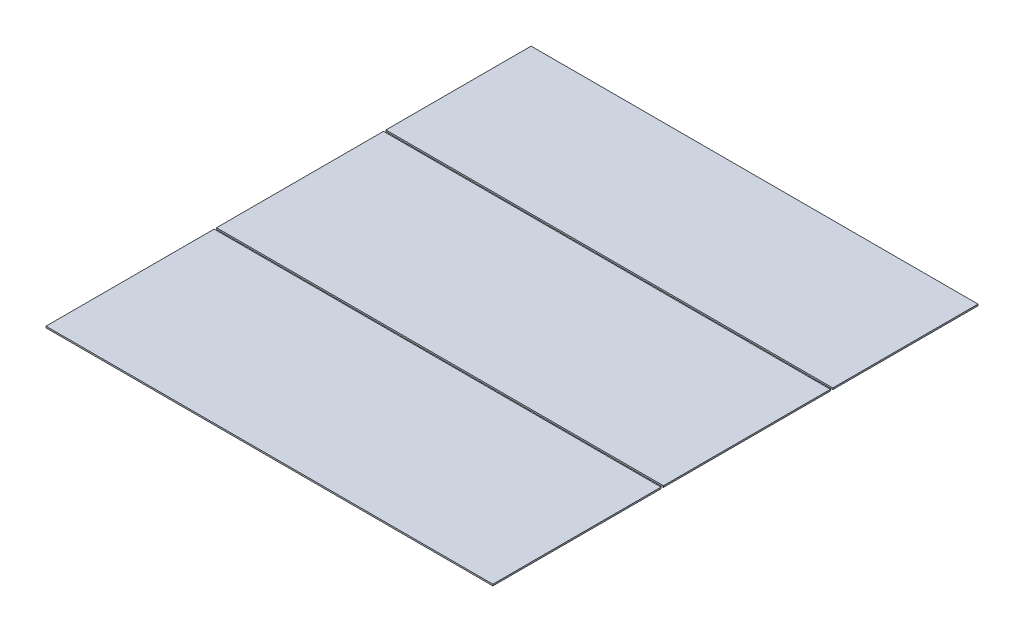
ISO-10303-21;
HEADER;
FILE_DESCRIPTION(('STEP AP214'),'2;1');
FILE_NAME('part.step','',(''),(''),'','','');
FILE_SCHEMA(('AUTOMOTIVE_DESIGN { 1 0 10303 214 1 1 1 1 }'));
ENDSEC;
DATA;
#1=APPLICATION_CONTEXT('core data for automotive mechanical design processes');
#2=APPLICATION_PROTOCOL_DEFINITION('international standard','automotive_design',2000,#1);
#3=PRODUCT_CONTEXT('',#1,'mechanical');
#4=PRODUCT('Part','Part','',(#3));
#5=PRODUCT_RELATED_PRODUCT_CATEGORY('part','',(#4));
#6=PRODUCT_DEFINITION_FORMATION('','',#4);
#7=PRODUCT_DEFINITION_CONTEXT('part definition',#1,'design');
#8=PRODUCT_DEFINITION('design','',#6,#7);
#9=PRODUCT_DEFINITION_SHAPE('','',#8);
#10=(LENGTH_UNIT() NAMED_UNIT(*) SI_UNIT(.MILLI.,.METRE.));
#11=(NAMED_UNIT(*) PLANE_ANGLE_UNIT() SI_UNIT($,.RADIAN.));
#12=(NAMED_UNIT(*) SI_UNIT($,.STERADIAN.) SOLID_ANGLE_UNIT());
#13=UNCERTAINTY_MEASURE_WITH_UNIT(LENGTH_MEASURE(1.E-05),#10,'distance_accuracy_value','');
#14=(GEOMETRIC_REPRESENTATION_CONTEXT(3) GLOBAL_UNCERTAINTY_ASSIGNED_CONTEXT((#13)) GLOBAL_UNIT_ASSIGNED_CONTEXT((#10,
#11,#12)) REPRESENTATION_CONTEXT('',''));
#15=CARTESIAN_POINT('',(0.,0.,0.));
#16=DIRECTION('',(0.,0.,1.));
#17=DIRECTION('',(1.,0.,0.));
#18=AXIS2_PLACEMENT_3D('',#15,#16,#17);
#19=CARTESIAN_POINT('',(0.,-2.5,0.));
#20=DIRECTION('',(0.,1.,0.));
#21=DIRECTION('',(0.,0.,1.));
#22=AXIS2_PLACEMENT_3D('',#19,#20,#21);
#23=PLANE('',#22);
#24=DIRECTION('',(0.,0.,1.));
#25=VECTOR('',#24,1.);
#26=CARTESIAN_POINT('',(-742.599999999654,-2.49999999999995,-315.532));
#27=LINE('',#26,#25);
#28=CARTESIAN_POINT('',(-742.599999999654,-2.49999999999995,-315.532));
#29=VERTEX_POINT('',#28);
#30=CARTESIAN_POINT('',(-742.599999999654,-2.49999999999995,239.331999999998));
#31=VERTEX_POINT('',#30);
#32=EDGE_CURVE('E106',#29,#31,#27,.T.);
#33=ORIENTED_EDGE('',*,*,#32,.F.);
#34=DIRECTION('',(-1.,0.,0.));
#35=VECTOR('',#34,1.);
#36=CARTESIAN_POINT('',(-742.599999999654,-2.49999999999995,-315.532));
#37=LINE('',#36,#35);
#38=CARTESIAN_POINT('',(742.599999999648,-2.49999999999995,-315.532));
#39=VERTEX_POINT('',#38);
#40=EDGE_CURVE('E98',#39,#29,#37,.T.);
#41=ORIENTED_EDGE('',*,*,#40,.F.);
#42=DIRECTION('',(0.,0.,-1.));
#43=VECTOR('',#42,1.);
#44=CARTESIAN_POINT('',(742.599999999648,-2.49999999999995,-315.532));
#45=LINE('',#44,#43);
#46=CARTESIAN_POINT('',(742.599999999648,-2.49999999999995,239.332));
#47=VERTEX_POINT('',#46);
#48=EDGE_CURVE('E84',#47,#39,#45,.T.);
#49=ORIENTED_EDGE('',*,*,#48,.F.);
#50=DIRECTION('',(1.,0.,0.));
#51=VECTOR('',#50,1.);
#52=CARTESIAN_POINT('',(-742.599999999654,-2.49999999999995,239.331999999998));
#53=LINE('',#52,#51);
#54=EDGE_CURVE('E95',#31,#47,#53,.T.);
#55=ORIENTED_EDGE('',*,*,#54,.F.);
#56=EDGE_LOOP('',(#33,#41,#49,#55));
#57=FACE_BOUND('',#56,.T.);
#58=ADVANCED_FACE('F44',(#57),#23,.F.);
#59=CARTESIAN_POINT('',(-742.599999999654,1589.33355076137,-315.532));
#60=DIRECTION('',(1.,0.,0.));
#61=DIRECTION('',(0.,0.,-1.));
#62=AXIS2_PLACEMENT_3D('',#59,#60,#61);
#63=PLANE('',#62);
#64=DIRECTION('',(0.,-1.,0.));
#65=VECTOR('',#64,1.);
#66=CARTESIAN_POINT('',(-742.599999999654,1589.33355076137,239.331999999998));
#67=LINE('',#66,#65);
#68=CARTESIAN_POINT('',(-742.599999999654,2.49999999999995,239.331999999998));
#69=VERTEX_POINT('',#68);
#70=EDGE_CURVE('E101',#69,#31,#67,.T.);
#71=ORIENTED_EDGE('',*,*,#70,.F.);
#72=DIRECTION('',(0.,0.,-1.));
#73=VECTOR('',#72,1.);
#74=CARTESIAN_POINT('',(-742.599999999654,2.49999999999995,-315.532));
#75=LINE('',#74,#73);
#76=CARTESIAN_POINT('',(-742.599999999654,2.49999999999995,-315.532));
#77=VERTEX_POINT('',#76);
#78=EDGE_CURVE('E60',#69,#77,#75,.T.);
#79=ORIENTED_EDGE('',*,*,#78,.T.);
#80=DIRECTION('',(0.,-1.,0.));
#81=VECTOR('',#80,1.);
#82=CARTESIAN_POINT('',(-742.599999999654,1589.33355076137,-315.532));
#83=LINE('',#82,#81);
#84=EDGE_CURVE('E103',#77,#29,#83,.T.);
#85=ORIENTED_EDGE('',*,*,#84,.T.);
#86=ORIENTED_EDGE('',*,*,#32,.T.);
#87=EDGE_LOOP('',(#71,#79,#85,#86));
#88=FACE_BOUND('',#87,.T.);
#89=ADVANCED_FACE('F118',(#88),#63,.F.);
#90=CARTESIAN_POINT('',(-742.599999999654,1589.33355076137,239.331999999998));
#91=DIRECTION('',(0.,0.,-1.));
#92=DIRECTION('',(-1.,0.,0.));
#93=AXIS2_PLACEMENT_3D('',#90,#91,#92);
#94=PLANE('',#93);
#95=DIRECTION('',(0.,-1.,0.));
#96=VECTOR('',#95,1.);
#97=CARTESIAN_POINT('',(742.599999999648,1589.33355076137,239.332));
#98=LINE('',#97,#96);
#99=CARTESIAN_POINT('',(742.599999999648,2.49999999999995,239.332));
#100=VERTEX_POINT('',#99);
#101=EDGE_CURVE('E80',#100,#47,#98,.T.);
#102=ORIENTED_EDGE('',*,*,#101,.F.);
#103=DIRECTION('',(-1.,0.,0.));
#104=VECTOR('',#103,1.);
#105=CARTESIAN_POINT('',(-742.599999999654,2.49999999999995,239.331999999998));
#106=LINE('',#105,#104);
#107=EDGE_CURVE('E109',#100,#69,#106,.T.);
#108=ORIENTED_EDGE('',*,*,#107,.T.);
#109=ORIENTED_EDGE('',*,*,#70,.T.);
#110=ORIENTED_EDGE('',*,*,#54,.T.);
#111=EDGE_LOOP('',(#102,#108,#109,#110));
#112=FACE_BOUND('',#111,.T.);
#113=ADVANCED_FACE('F100',(#112),#94,.F.);
#114=CARTESIAN_POINT('',(742.599999999648,1589.33355076137,-315.532));
#115=DIRECTION('',(-1.,0.,0.));
#116=DIRECTION('',(0.,0.,1.));
#117=AXIS2_PLACEMENT_3D('',#114,#115,#116);
#118=PLANE('',#117);
#119=DIRECTION('',(0.,-1.,0.));
#120=VECTOR('',#119,1.);
#121=CARTESIAN_POINT('',(742.599999999648,1589.33355076137,-315.532));
#122=LINE('',#121,#120);
#123=CARTESIAN_POINT('',(742.599999999648,2.49999999999995,-315.532));
#124=VERTEX_POINT('',#123);
#125=EDGE_CURVE('E12',#124,#39,#122,.T.);
#126=ORIENTED_EDGE('',*,*,#125,.F.);
#127=DIRECTION('',(0.,0.,1.));
#128=VECTOR('',#127,1.);
#129=CARTESIAN_POINT('',(742.599999999648,2.49999999999995,-315.532));
#130=LINE('',#129,#128);
#131=EDGE_CURVE('E86',#124,#100,#130,.T.);
#132=ORIENTED_EDGE('',*,*,#131,.T.);
#133=ORIENTED_EDGE('',*,*,#101,.T.);
#134=ORIENTED_EDGE('',*,*,#48,.T.);
#135=EDGE_LOOP('',(#126,#132,#133,#134));
#136=FACE_BOUND('',#135,.T.);
#137=ADVANCED_FACE('F83',(#136),#118,.F.);
#138=CARTESIAN_POINT('',(-742.599999999654,1589.33355076137,-315.532));
#139=DIRECTION('',(0.,0.,1.));
#140=DIRECTION('',(1.,0.,0.));
#141=AXIS2_PLACEMENT_3D('',#138,#139,#140);
#142=PLANE('',#141);
#143=ORIENTED_EDGE('',*,*,#84,.F.);
#144=DIRECTION('',(1.,0.,0.));
#145=VECTOR('',#144,1.);
#146=CARTESIAN_POINT('',(-742.599999999654,2.49999999999995,-315.532));
#147=LINE('',#146,#145);
#148=EDGE_CURVE('E47',#77,#124,#147,.T.);
#149=ORIENTED_EDGE('',*,*,#148,.T.);
#150=ORIENTED_EDGE('',*,*,#125,.T.);
#151=ORIENTED_EDGE('',*,*,#40,.T.);
#152=EDGE_LOOP('',(#143,#149,#150,#151));
#153=FACE_BOUND('',#152,.T.);
#154=ADVANCED_FACE('F116',(#153),#142,.F.);
#155=CARTESIAN_POINT('',(0.,2.5,0.));
#156=DIRECTION('',(0.,1.,0.));
#157=DIRECTION('',(0.,0.,1.));
#158=AXIS2_PLACEMENT_3D('',#155,#156,#157);
#159=PLANE('',#158);
#160=ORIENTED_EDGE('',*,*,#107,.F.);
#161=ORIENTED_EDGE('',*,*,#131,.F.);
#162=ORIENTED_EDGE('',*,*,#148,.F.);
#163=ORIENTED_EDGE('',*,*,#78,.F.);
#164=EDGE_LOOP('',(#160,#161,#162,#163));
#165=FACE_BOUND('',#164,.T.);
#166=ADVANCED_FACE('F112',(#165),#159,.T.);
#167=CLOSED_SHELL('',(#58,#89,#113,#137,#154,#166));
#168=MANIFOLD_SOLID_BREP('B2',#167);
#169=CARTESIAN_POINT('',(0.,-2.5,0.));
#170=DIRECTION('',(0.,-1.,0.));
#171=DIRECTION('',(0.,0.,-1.));
#172=AXIS2_PLACEMENT_3D('',#169,#170,#171);
#173=PLANE('',#172);
#174=DIRECTION('',(0.,0.,-1.));
#175=VECTOR('',#174,1.);
#176=CARTESIAN_POINT('',(742.599999999648,-2.49999999999995,806.1));
#177=LINE('',#176,#175);
#178=CARTESIAN_POINT('',(742.599999999648,-2.49999999999995,806.1));
#179=VERTEX_POINT('',#178);
#180=CARTESIAN_POINT('',(742.599999999648,-2.49999999999995,247.332));
#181=VERTEX_POINT('',#180);
#182=EDGE_CURVE('E245',#179,#181,#177,.T.);
#183=ORIENTED_EDGE('',*,*,#182,.F.);
#184=DIRECTION('',(1.,0.,0.));
#185=VECTOR('',#184,1.);
#186=CARTESIAN_POINT('',(742.599999999648,-2.49999999999995,806.1));
#187=LINE('',#186,#185);
#188=CARTESIAN_POINT('',(-742.599999999655,-2.49999999999995,806.099999999999));
#189=VERTEX_POINT('',#188);
#190=EDGE_CURVE('E237',#189,#179,#187,.T.);
#191=ORIENTED_EDGE('',*,*,#190,.F.);
#192=DIRECTION('',(0.,0.,1.));
#193=VECTOR('',#192,1.);
#194=CARTESIAN_POINT('',(-742.599999999655,-2.49999999999995,806.099999999999));
#195=LINE('',#194,#193);
#196=CARTESIAN_POINT('',(-742.599999999655,-2.49999999999995,247.331999999998));
#197=VERTEX_POINT('',#196);
#198=EDGE_CURVE('E223',#197,#189,#195,.T.);
#199=ORIENTED_EDGE('',*,*,#198,.F.);
#200=DIRECTION('',(-1.,0.,0.));
#201=VECTOR('',#200,1.);
#202=CARTESIAN_POINT('',(742.599999999648,-2.49999999999995,247.332));
#203=LINE('',#202,#201);
#204=EDGE_CURVE('E234',#181,#197,#203,.T.);
#205=ORIENTED_EDGE('',*,*,#204,.F.);
#206=EDGE_LOOP('',(#183,#191,#199,#205));
#207=FACE_BOUND('',#206,.T.);
#208=ADVANCED_FACE('F183',(#207),#173,.T.);
#209=CARTESIAN_POINT('',(742.599999999648,1589.33355076137,806.1));
#210=DIRECTION('',(-1.,0.,0.));
#211=DIRECTION('',(0.,0.,1.));
#212=AXIS2_PLACEMENT_3D('',#209,#210,#211);
#213=PLANE('',#212);
#214=DIRECTION('',(0.,-1.,0.));
#215=VECTOR('',#214,1.);
#216=CARTESIAN_POINT('',(742.599999999648,1589.33355076137,247.332));
#217=LINE('',#216,#215);
#218=CARTESIAN_POINT('',(742.599999999648,2.49999999999995,247.332));
#219=VERTEX_POINT('',#218);
#220=EDGE_CURVE('E240',#219,#181,#217,.T.);
#221=ORIENTED_EDGE('',*,*,#220,.F.);
#222=DIRECTION('',(0.,0.,1.));
#223=VECTOR('',#222,1.);
#224=CARTESIAN_POINT('',(742.599999999648,2.49999999999995,806.1));
#225=LINE('',#224,#223);
#226=CARTESIAN_POINT('',(742.599999999648,2.49999999999995,806.1));
#227=VERTEX_POINT('',#226);
#228=EDGE_CURVE('E199',#219,#227,#225,.T.);
#229=ORIENTED_EDGE('',*,*,#228,.T.);
#230=DIRECTION('',(0.,-1.,0.));
#231=VECTOR('',#230,1.);
#232=CARTESIAN_POINT('',(742.599999999648,1589.33355076137,806.1));
#233=LINE('',#232,#231);
#234=EDGE_CURVE('E242',#227,#179,#233,.T.);
#235=ORIENTED_EDGE('',*,*,#234,.T.);
#236=ORIENTED_EDGE('',*,*,#182,.T.);
#237=EDGE_LOOP('',(#221,#229,#235,#236));
#238=FACE_BOUND('',#237,.T.);
#239=ADVANCED_FACE('F257',(#238),#213,.F.);
#240=CARTESIAN_POINT('',(742.599999999648,1589.33355076137,247.332));
#241=DIRECTION('',(0.,0.,1.));
#242=DIRECTION('',(1.,0.,0.));
#243=AXIS2_PLACEMENT_3D('',#240,#241,#242);
#244=PLANE('',#243);
#245=DIRECTION('',(0.,-1.,0.));
#246=VECTOR('',#245,1.);
#247=CARTESIAN_POINT('',(-742.599999999655,1589.33355076137,247.331999999998));
#248=LINE('',#247,#246);
#249=CARTESIAN_POINT('',(-742.599999999655,2.49999999999995,247.331999999998));
#250=VERTEX_POINT('',#249);
#251=EDGE_CURVE('E219',#250,#197,#248,.T.);
#252=ORIENTED_EDGE('',*,*,#251,.F.);
#253=DIRECTION('',(1.,0.,0.));
#254=VECTOR('',#253,1.);
#255=CARTESIAN_POINT('',(742.599999999648,2.49999999999995,247.332));
#256=LINE('',#255,#254);
#257=EDGE_CURVE('E248',#250,#219,#256,.T.);
#258=ORIENTED_EDGE('',*,*,#257,.T.);
#259=ORIENTED_EDGE('',*,*,#220,.T.);
#260=ORIENTED_EDGE('',*,*,#204,.T.);
#261=EDGE_LOOP('',(#252,#258,#259,#260));
#262=FACE_BOUND('',#261,.T.);
#263=ADVANCED_FACE('F239',(#262),#244,.F.);
#264=CARTESIAN_POINT('',(-742.599999999655,1589.33355076137,806.099999999999));
#265=DIRECTION('',(1.,0.,0.));
#266=DIRECTION('',(0.,0.,-1.));
#267=AXIS2_PLACEMENT_3D('',#264,#265,#266);
#268=PLANE('',#267);
#269=DIRECTION('',(0.,-1.,0.));
#270=VECTOR('',#269,1.);
#271=CARTESIAN_POINT('',(-742.599999999655,1589.33355076137,806.099999999999));
#272=LINE('',#271,#270);
#273=CARTESIAN_POINT('',(-742.599999999655,2.49999999999995,806.099999999999));
#274=VERTEX_POINT('',#273);
#275=EDGE_CURVE('E42',#274,#189,#272,.T.);
#276=ORIENTED_EDGE('',*,*,#275,.F.);
#277=DIRECTION('',(0.,0.,-1.));
#278=VECTOR('',#277,1.);
#279=CARTESIAN_POINT('',(-742.599999999655,2.49999999999995,806.099999999999));
#280=LINE('',#279,#278);
#281=EDGE_CURVE('E225',#274,#250,#280,.T.);
#282=ORIENTED_EDGE('',*,*,#281,.T.);
#283=ORIENTED_EDGE('',*,*,#251,.T.);
#284=ORIENTED_EDGE('',*,*,#198,.T.);
#285=EDGE_LOOP('',(#276,#282,#283,#284));
#286=FACE_BOUND('',#285,.T.);
#287=ADVANCED_FACE('F222',(#286),#268,.F.);
#288=CARTESIAN_POINT('',(742.599999999648,1589.33355076137,806.1));
#289=DIRECTION('',(0.,0.,-1.));
#290=DIRECTION('',(-1.,0.,0.));
#291=AXIS2_PLACEMENT_3D('',#288,#289,#290);
#292=PLANE('',#291);
#293=ORIENTED_EDGE('',*,*,#234,.F.);
#294=DIRECTION('',(-1.,0.,0.));
#295=VECTOR('',#294,1.);
#296=CARTESIAN_POINT('',(742.599999999648,2.49999999999995,806.1));
#297=LINE('',#296,#295);
#298=EDGE_CURVE('E186',#227,#274,#297,.T.);
#299=ORIENTED_EDGE('',*,*,#298,.T.);
#300=ORIENTED_EDGE('',*,*,#275,.T.);
#301=ORIENTED_EDGE('',*,*,#190,.T.);
#302=EDGE_LOOP('',(#293,#299,#300,#301));
#303=FACE_BOUND('',#302,.T.);
#304=ADVANCED_FACE('F255',(#303),#292,.F.);
#305=CARTESIAN_POINT('',(0.,2.5,0.));
#306=DIRECTION('',(0.,-1.,0.));
#307=DIRECTION('',(0.,0.,-1.));
#308=AXIS2_PLACEMENT_3D('',#305,#306,#307);
#309=PLANE('',#308);
#310=ORIENTED_EDGE('',*,*,#257,.F.);
#311=ORIENTED_EDGE('',*,*,#281,.F.);
#312=ORIENTED_EDGE('',*,*,#298,.F.);
#313=ORIENTED_EDGE('',*,*,#228,.F.);
#314=EDGE_LOOP('',(#310,#311,#312,#313));
#315=FACE_BOUND('',#314,.T.);
#316=ADVANCED_FACE('F251',(#315),#309,.F.);
#317=CLOSED_SHELL('',(#208,#239,#263,#287,#304,#316));
#318=MANIFOLD_SOLID_BREP('B6',#317);
#319=CARTESIAN_POINT('',(0.,-2.5,0.));
#320=DIRECTION('',(0.,-1.,0.));
#321=DIRECTION('',(0.,0.,-1.));
#322=AXIS2_PLACEMENT_3D('',#319,#320,#321);
#323=PLANE('',#322);
#324=DIRECTION('',(0.,0.,1.));
#325=VECTOR('',#324,1.);
#326=CARTESIAN_POINT('',(-742.599999999655,-2.49999999999995,-806.100000000004));
#327=LINE('',#326,#325);
#328=CARTESIAN_POINT('',(-742.599999999655,-2.49999999999995,-806.100000000004));
#329=VERTEX_POINT('',#328);
#330=CARTESIAN_POINT('',(-742.599999999654,-2.49999999999995,-323.532));
#331=VERTEX_POINT('',#330);
#332=EDGE_CURVE('E375',#329,#331,#327,.T.);
#333=ORIENTED_EDGE('',*,*,#332,.F.);
#334=DIRECTION('',(-1.,0.,0.));
#335=VECTOR('',#334,1.);
#336=CARTESIAN_POINT('',(-742.599999999655,-2.49999999999995,-806.100000000004));
#337=LINE('',#336,#335);
#338=CARTESIAN_POINT('',(742.599999999648,-2.49999999999995,-806.1));
#339=VERTEX_POINT('',#338);
#340=EDGE_CURVE('E367',#339,#329,#337,.T.);
#341=ORIENTED_EDGE('',*,*,#340,.F.);
#342=DIRECTION('',(0.,0.,-1.));
#343=VECTOR('',#342,1.);
#344=CARTESIAN_POINT('',(742.599999999648,-2.49999999999995,-806.1));
#345=LINE('',#344,#343);
#346=CARTESIAN_POINT('',(742.599999999648,-2.49999999999995,-323.532));
#347=VERTEX_POINT('',#346);
#348=EDGE_CURVE('E353',#347,#339,#345,.T.);
#349=ORIENTED_EDGE('',*,*,#348,.F.);
#350=DIRECTION('',(1.,0.,0.));
#351=VECTOR('',#350,1.);
#352=CARTESIAN_POINT('',(-742.599999999654,-2.49999999999995,-323.532));
#353=LINE('',#352,#351);
#354=EDGE_CURVE('E364',#331,#347,#353,.T.);
#355=ORIENTED_EDGE('',*,*,#354,.F.);
#356=EDGE_LOOP('',(#333,#341,#349,#355));
#357=FACE_BOUND('',#356,.T.);
#358=ADVANCED_FACE('F313',(#357),#323,.T.);
#359=CARTESIAN_POINT('',(-742.599999999655,1589.33355076137,-806.100000000004));
#360=DIRECTION('',(1.,0.,0.));
#361=DIRECTION('',(0.,0.,-1.));
#362=AXIS2_PLACEMENT_3D('',#359,#360,#361);
#363=PLANE('',#362);
#364=DIRECTION('',(0.,-1.,0.));
#365=VECTOR('',#364,1.);
#366=CARTESIAN_POINT('',(-742.599999999654,1589.33355076137,-323.532));
#367=LINE('',#366,#365);
#368=CARTESIAN_POINT('',(-742.599999999654,2.49999999999995,-323.532));
#369=VERTEX_POINT('',#368);
#370=EDGE_CURVE('E370',#369,#331,#367,.T.);
#371=ORIENTED_EDGE('',*,*,#370,.F.);
#372=DIRECTION('',(0.,0.,-1.));
#373=VECTOR('',#372,1.);
#374=CARTESIAN_POINT('',(-742.599999999655,2.49999999999995,-806.100000000004));
#375=LINE('',#374,#373);
#376=CARTESIAN_POINT('',(-742.599999999655,2.49999999999995,-806.100000000004));
#377=VERTEX_POINT('',#376);
#378=EDGE_CURVE('E329',#369,#377,#375,.T.);
#379=ORIENTED_EDGE('',*,*,#378,.T.);
#380=DIRECTION('',(0.,-1.,0.));
#381=VECTOR('',#380,1.);
#382=CARTESIAN_POINT('',(-742.599999999655,1589.33355076137,-806.100000000004));
#383=LINE('',#382,#381);
#384=EDGE_CURVE('E372',#377,#329,#383,.T.);
#385=ORIENTED_EDGE('',*,*,#384,.T.);
#386=ORIENTED_EDGE('',*,*,#332,.T.);
#387=EDGE_LOOP('',(#371,#379,#385,#386));
#388=FACE_BOUND('',#387,.T.);
#389=ADVANCED_FACE('F387',(#388),#363,.F.);
#390=CARTESIAN_POINT('',(-742.599999999654,1589.33355076137,-323.532));
#391=DIRECTION('',(0.,0.,-1.));
#392=DIRECTION('',(-1.,0.,0.));
#393=AXIS2_PLACEMENT_3D('',#390,#391,#392);
#394=PLANE('',#393);
#395=DIRECTION('',(0.,-1.,0.));
#396=VECTOR('',#395,1.);
#397=CARTESIAN_POINT('',(742.599999999648,1589.33355076137,-323.532));
#398=LINE('',#397,#396);
#399=CARTESIAN_POINT('',(742.599999999648,2.49999999999995,-323.532));
#400=VERTEX_POINT('',#399);
#401=EDGE_CURVE('E349',#400,#347,#398,.T.);
#402=ORIENTED_EDGE('',*,*,#401,.F.);
#403=DIRECTION('',(-1.,0.,0.));
#404=VECTOR('',#403,1.);
#405=CARTESIAN_POINT('',(-742.599999999654,2.49999999999995,-323.532));
#406=LINE('',#405,#404);
#407=EDGE_CURVE('E378',#400,#369,#406,.T.);
#408=ORIENTED_EDGE('',*,*,#407,.T.);
#409=ORIENTED_EDGE('',*,*,#370,.T.);
#410=ORIENTED_EDGE('',*,*,#354,.T.);
#411=EDGE_LOOP('',(#402,#408,#409,#410));
#412=FACE_BOUND('',#411,.T.);
#413=ADVANCED_FACE('F369',(#412),#394,.F.);
#414=CARTESIAN_POINT('',(742.599999999648,1589.33355076137,-806.1));
#415=DIRECTION('',(-1.,0.,0.));
#416=DIRECTION('',(0.,0.,1.));
#417=AXIS2_PLACEMENT_3D('',#414,#415,#416);
#418=PLANE('',#417);
#419=DIRECTION('',(0.,-1.,0.));
#420=VECTOR('',#419,1.);
#421=CARTESIAN_POINT('',(742.599999999648,1589.33355076137,-806.1));
#422=LINE('',#421,#420);
#423=CARTESIAN_POINT('',(742.599999999648,2.49999999999995,-806.1));
#424=VERTEX_POINT('',#423);
#425=EDGE_CURVE('E181',#424,#339,#422,.T.);
#426=ORIENTED_EDGE('',*,*,#425,.F.);
#427=DIRECTION('',(0.,0.,1.));
#428=VECTOR('',#427,1.);
#429=CARTESIAN_POINT('',(742.599999999648,2.49999999999995,-806.1));
#430=LINE('',#429,#428);
#431=EDGE_CURVE('E355',#424,#400,#430,.T.);
#432=ORIENTED_EDGE('',*,*,#431,.T.);
#433=ORIENTED_EDGE('',*,*,#401,.T.);
#434=ORIENTED_EDGE('',*,*,#348,.T.);
#435=EDGE_LOOP('',(#426,#432,#433,#434));
#436=FACE_BOUND('',#435,.T.);
#437=ADVANCED_FACE('F352',(#436),#418,.F.);
#438=CARTESIAN_POINT('',(-742.599999999655,1589.33355076137,-806.100000000004));
#439=DIRECTION('',(0.,0.,1.));
#440=DIRECTION('',(1.,0.,0.));
#441=AXIS2_PLACEMENT_3D('',#438,#439,#440);
#442=PLANE('',#441);
#443=ORIENTED_EDGE('',*,*,#384,.F.);
#444=DIRECTION('',(1.,0.,0.));
#445=VECTOR('',#444,1.);
#446=CARTESIAN_POINT('',(-742.599999999655,2.49999999999995,-806.100000000004));
#447=LINE('',#446,#445);
#448=EDGE_CURVE('E316',#377,#424,#447,.T.);
#449=ORIENTED_EDGE('',*,*,#448,.T.);
#450=ORIENTED_EDGE('',*,*,#425,.T.);
#451=ORIENTED_EDGE('',*,*,#340,.T.);
#452=EDGE_LOOP('',(#443,#449,#450,#451));
#453=FACE_BOUND('',#452,.T.);
#454=ADVANCED_FACE('F385',(#453),#442,.F.);
#455=CARTESIAN_POINT('',(0.,2.5,0.));
#456=DIRECTION('',(0.,-1.,0.));
#457=DIRECTION('',(0.,0.,-1.));
#458=AXIS2_PLACEMENT_3D('',#455,#456,#457);
#459=PLANE('',#458);
#460=ORIENTED_EDGE('',*,*,#407,.F.);
#461=ORIENTED_EDGE('',*,*,#431,.F.);
#462=ORIENTED_EDGE('',*,*,#448,.F.);
#463=ORIENTED_EDGE('',*,*,#378,.F.);
#464=EDGE_LOOP('',(#460,#461,#462,#463));
#465=FACE_BOUND('',#464,.T.);
#466=ADVANCED_FACE('F381',(#465),#459,.F.);
#467=CLOSED_SHELL('',(#358,#389,#413,#437,#454,#466));
#468=MANIFOLD_SOLID_BREP('B36',#467);
#469=ADVANCED_BREP_SHAPE_REPRESENTATION('',(#18,#168,#318,#468),#14);
#470=SHAPE_DEFINITION_REPRESENTATION(#9,#469);
ENDSEC;
END-ISO-10303-21;
